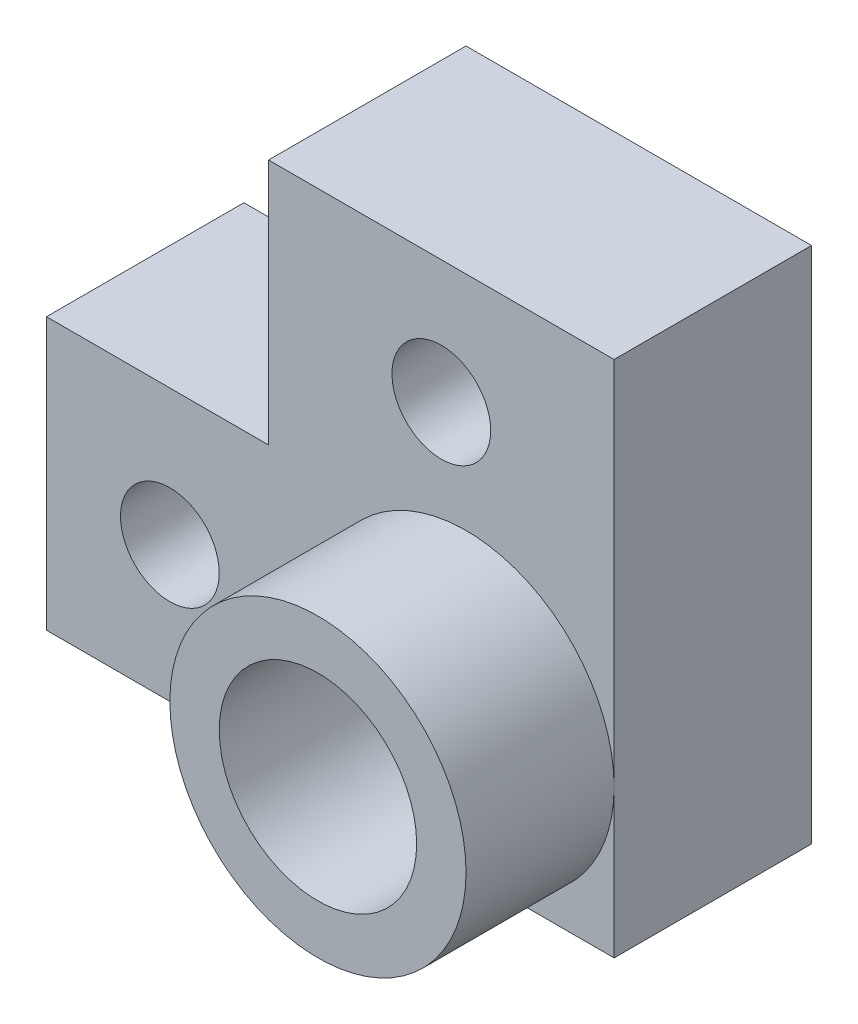
ISO-10303-21;
HEADER;
FILE_DESCRIPTION(('STEP AP214'),'2;1');
FILE_NAME('part.step','',(''),(''),'','','');
FILE_SCHEMA(('AUTOMOTIVE_DESIGN { 1 0 10303 214 1 1 1 1 }'));
ENDSEC;
DATA;
#1=APPLICATION_CONTEXT('core data for automotive mechanical design processes');
#2=APPLICATION_PROTOCOL_DEFINITION('international standard','automotive_design',2000,#1);
#3=PRODUCT_CONTEXT('',#1,'mechanical');
#4=PRODUCT('Part','Part','',(#3));
#5=PRODUCT_RELATED_PRODUCT_CATEGORY('part','',(#4));
#6=PRODUCT_DEFINITION_FORMATION('','',#4);
#7=PRODUCT_DEFINITION_CONTEXT('part definition',#1,'design');
#8=PRODUCT_DEFINITION('design','',#6,#7);
#9=PRODUCT_DEFINITION_SHAPE('','',#8);
#10=(LENGTH_UNIT() NAMED_UNIT(*) SI_UNIT(.MILLI.,.METRE.));
#11=(NAMED_UNIT(*) PLANE_ANGLE_UNIT() SI_UNIT($,.RADIAN.));
#12=(NAMED_UNIT(*) SI_UNIT($,.STERADIAN.) SOLID_ANGLE_UNIT());
#13=UNCERTAINTY_MEASURE_WITH_UNIT(LENGTH_MEASURE(1.E-05),#10,'distance_accuracy_value','');
#14=(GEOMETRIC_REPRESENTATION_CONTEXT(3) GLOBAL_UNCERTAINTY_ASSIGNED_CONTEXT((#13)) GLOBAL_UNIT_ASSIGNED_CONTEXT((#10,
#11,#12)) REPRESENTATION_CONTEXT('',''));
#15=CARTESIAN_POINT('',(0.,0.,0.));
#16=DIRECTION('',(0.,0.,1.));
#17=DIRECTION('',(1.,0.,0.));
#18=AXIS2_PLACEMENT_3D('',#15,#16,#17);
#19=CARTESIAN_POINT('',(0.,0.,8.));
#20=DIRECTION('',(0.,0.,1.));
#21=DIRECTION('',(1.,0.,0.));
#22=AXIS2_PLACEMENT_3D('',#19,#20,#21);
#23=PLANE('',#22);
#24=CARTESIAN_POINT('',(4.20529801324502,6.91390728476822,8.));
#25=DIRECTION('',(0.,0.,1.));
#26=DIRECTION('',(1.,0.,0.));
#27=AXIS2_PLACEMENT_3D('',#24,#25,#26);
#28=CIRCLE('',#27,6.);
#29=CARTESIAN_POINT('',(10.205298013245,6.91390728476822,8.));
#30=VERTEX_POINT('',#29);
#31=CARTESIAN_POINT('',(4.20529801324502,0.913907284768216,8.));
#32=VERTEX_POINT('',#31);
#33=EDGE_CURVE('E46',#30,#32,#28,.T.);
#34=ORIENTED_EDGE('',*,*,#33,.F.);
#35=DIRECTION('',(0.,1.,0.));
#36=VECTOR('',#35,1.);
#37=CARTESIAN_POINT('',(10.205298013245,11.9139072847682,8.));
#38=LINE('',#37,#36);
#39=CARTESIAN_POINT('',(10.205298013245,21.9139072847682,8.));
#40=VERTEX_POINT('',#39);
#41=EDGE_CURVE('E101',#30,#40,#38,.T.);
#42=ORIENTED_EDGE('',*,*,#41,.T.);
#43=DIRECTION('',(1.,0.,0.));
#44=VECTOR('',#43,1.);
#45=CARTESIAN_POINT('',(10.205298013245,21.9139072847682,8.));
#46=LINE('',#45,#44);
#47=CARTESIAN_POINT('',(-3.79470198675498,21.9139072847682,8.));
#48=VERTEX_POINT('',#47);
#49=EDGE_CURVE('E199',#48,#40,#46,.T.);
#50=ORIENTED_EDGE('',*,*,#49,.F.);
#51=DIRECTION('',(0.,-1.,0.));
#52=VECTOR('',#51,1.);
#53=CARTESIAN_POINT('',(-3.79470198675498,21.9139072847682,8.));
#54=LINE('',#53,#52);
#55=CARTESIAN_POINT('',(-3.79470198675498,11.9139072847682,8.));
#56=VERTEX_POINT('',#55);
#57=EDGE_CURVE('E201',#48,#56,#54,.T.);
#58=ORIENTED_EDGE('',*,*,#57,.T.);
#59=DIRECTION('',(-1.,0.,0.));
#60=VECTOR('',#59,1.);
#61=CARTESIAN_POINT('',(-12.794701986755,11.9139072847682,8.));
#62=LINE('',#61,#60);
#63=CARTESIAN_POINT('',(-12.794701986755,11.9139072847682,8.));
#64=VERTEX_POINT('',#63);
#65=EDGE_CURVE('E100',#56,#64,#62,.T.);
#66=ORIENTED_EDGE('',*,*,#65,.T.);
#67=DIRECTION('',(0.,-1.,0.));
#68=VECTOR('',#67,1.);
#69=CARTESIAN_POINT('',(-12.794701986755,11.9139072847682,8.));
#70=LINE('',#69,#68);
#71=CARTESIAN_POINT('',(-12.794701986755,0.913907284768216,8.));
#72=VERTEX_POINT('',#71);
#73=EDGE_CURVE('E177',#64,#72,#70,.T.);
#74=ORIENTED_EDGE('',*,*,#73,.T.);
#75=DIRECTION('',(1.,0.,0.));
#76=VECTOR('',#75,1.);
#77=CARTESIAN_POINT('',(-12.794701986755,0.913907284768216,8.));
#78=LINE('',#77,#76);
#79=EDGE_CURVE('E111',#72,#32,#78,.T.);
#80=ORIENTED_EDGE('',*,*,#79,.T.);
#81=EDGE_LOOP('',(#34,#42,#50,#58,#66,#74,#80));
#82=FACE_BOUND('',#81,.T.);
#83=CARTESIAN_POINT('',(-7.79470198675497,6.41390728476822,8.));
#84=DIRECTION('',(0.,0.,1.));
#85=DIRECTION('',(1.,0.,0.));
#86=AXIS2_PLACEMENT_3D('',#83,#84,#85);
#87=CIRCLE('',#86,2.);
#88=CARTESIAN_POINT('',(-5.79470198675497,6.41390728476822,8.));
#89=VERTEX_POINT('',#88);
#90=EDGE_CURVE('E187',#89,#89,#87,.T.);
#91=ORIENTED_EDGE('',*,*,#90,.F.);
#92=EDGE_LOOP('',(#91));
#93=FACE_BOUND('',#92,.T.);
#94=CARTESIAN_POINT('',(3.20529801324502,16.9139072847682,8.));
#95=DIRECTION('',(0.,0.,1.));
#96=DIRECTION('',(1.,0.,0.));
#97=AXIS2_PLACEMENT_3D('',#94,#95,#96);
#98=CIRCLE('',#97,2.);
#99=CARTESIAN_POINT('',(5.20529801324503,16.9139072847682,8.));
#100=VERTEX_POINT('',#99);
#101=EDGE_CURVE('E214',#100,#100,#98,.T.);
#102=ORIENTED_EDGE('',*,*,#101,.F.);
#103=EDGE_LOOP('',(#102));
#104=FACE_BOUND('',#103,.T.);
#105=ADVANCED_FACE('F35',(#82,#93,#104),#23,.T.);
#106=CARTESIAN_POINT('',(-12.794701986755,11.9139072847682,8.));
#107=DIRECTION('',(0.,-1.,0.));
#108=DIRECTION('',(0.,0.,-1.));
#109=AXIS2_PLACEMENT_3D('',#106,#107,#108);
#110=PLANE('',#109);
#111=DIRECTION('',(0.,0.,1.));
#112=VECTOR('',#111,1.);
#113=CARTESIAN_POINT('',(-3.79470198675498,11.9139072847682,8.));
#114=LINE('',#113,#112);
#115=CARTESIAN_POINT('',(-3.79470198675498,11.9139072847682,0.));
#116=VERTEX_POINT('',#115);
#117=EDGE_CURVE('E59',#116,#56,#114,.T.);
#118=ORIENTED_EDGE('',*,*,#117,.F.);
#119=DIRECTION('',(-1.,0.,0.));
#120=VECTOR('',#119,1.);
#121=CARTESIAN_POINT('',(-12.794701986755,11.9139072847682,0.));
#122=LINE('',#121,#120);
#123=CARTESIAN_POINT('',(-12.794701986755,11.9139072847682,0.));
#124=VERTEX_POINT('',#123);
#125=EDGE_CURVE('E175',#116,#124,#122,.T.);
#126=ORIENTED_EDGE('',*,*,#125,.T.);
#127=DIRECTION('',(0.,0.,-1.));
#128=VECTOR('',#127,1.);
#129=CARTESIAN_POINT('',(-12.794701986755,11.9139072847682,8.));
#130=LINE('',#129,#128);
#131=EDGE_CURVE('E171',#64,#124,#130,.T.);
#132=ORIENTED_EDGE('',*,*,#131,.F.);
#133=ORIENTED_EDGE('',*,*,#65,.F.);
#134=EDGE_LOOP('',(#118,#126,#132,#133));
#135=FACE_BOUND('',#134,.T.);
#136=ADVANCED_FACE('F133',(#135),#110,.F.);
#137=CARTESIAN_POINT('',(-12.794701986755,11.9139072847682,8.));
#138=DIRECTION('',(1.,0.,0.));
#139=DIRECTION('',(0.,0.,-1.));
#140=AXIS2_PLACEMENT_3D('',#137,#138,#139);
#141=PLANE('',#140);
#142=DIRECTION('',(0.,-1.,0.));
#143=VECTOR('',#142,1.);
#144=CARTESIAN_POINT('',(-12.794701986755,11.9139072847682,0.));
#145=LINE('',#144,#143);
#146=CARTESIAN_POINT('',(-12.794701986755,0.913907284768216,0.));
#147=VERTEX_POINT('',#146);
#148=EDGE_CURVE('E168',#124,#147,#145,.T.);
#149=ORIENTED_EDGE('',*,*,#148,.T.);
#150=DIRECTION('',(0.,0.,-1.));
#151=VECTOR('',#150,1.);
#152=CARTESIAN_POINT('',(-12.794701986755,0.913907284768216,8.));
#153=LINE('',#152,#151);
#154=EDGE_CURVE('E44',#72,#147,#153,.T.);
#155=ORIENTED_EDGE('',*,*,#154,.F.);
#156=ORIENTED_EDGE('',*,*,#73,.F.);
#157=ORIENTED_EDGE('',*,*,#131,.T.);
#158=EDGE_LOOP('',(#149,#155,#156,#157));
#159=FACE_BOUND('',#158,.T.);
#160=ADVANCED_FACE('F37',(#159),#141,.F.);
#161=CARTESIAN_POINT('',(-12.794701986755,0.913907284768216,8.));
#162=DIRECTION('',(0.,1.,0.));
#163=DIRECTION('',(0.,0.,1.));
#164=AXIS2_PLACEMENT_3D('',#161,#162,#163);
#165=PLANE('',#164);
#166=DIRECTION('',(1.,0.,0.));
#167=VECTOR('',#166,1.);
#168=CARTESIAN_POINT('',(-12.794701986755,0.913907284768216,0.));
#169=LINE('',#168,#167);
#170=CARTESIAN_POINT('',(10.205298013245,0.913907284768216,0.));
#171=VERTEX_POINT('',#170);
#172=EDGE_CURVE('E160',#147,#171,#169,.T.);
#173=ORIENTED_EDGE('',*,*,#172,.T.);
#174=DIRECTION('',(0.,0.,-1.));
#175=VECTOR('',#174,1.);
#176=CARTESIAN_POINT('',(10.205298013245,0.913907284768216,8.));
#177=LINE('',#176,#175);
#178=CARTESIAN_POINT('',(10.205298013245,0.913907284768216,8.));
#179=VERTEX_POINT('',#178);
#180=EDGE_CURVE('E161',#179,#171,#177,.T.);
#181=ORIENTED_EDGE('',*,*,#180,.F.);
#182=EDGE_CURVE('E96',#32,#179,#78,.T.);
#183=ORIENTED_EDGE('',*,*,#182,.F.);
#184=ORIENTED_EDGE('',*,*,#79,.F.);
#185=ORIENTED_EDGE('',*,*,#154,.T.);
#186=EDGE_LOOP('',(#173,#181,#183,#184,#185));
#187=FACE_BOUND('',#186,.T.);
#188=ADVANCED_FACE('F149',(#187),#165,.F.);
#189=CARTESIAN_POINT('',(10.205298013245,11.9139072847682,8.));
#190=DIRECTION('',(-1.,0.,0.));
#191=DIRECTION('',(0.,0.,1.));
#192=AXIS2_PLACEMENT_3D('',#189,#190,#191);
#193=PLANE('',#192);
#194=DIRECTION('',(0.,1.,0.));
#195=VECTOR('',#194,1.);
#196=CARTESIAN_POINT('',(10.205298013245,11.9139072847682,0.));
#197=LINE('',#196,#195);
#198=CARTESIAN_POINT('',(10.205298013245,21.9139072847682,0.));
#199=VERTEX_POINT('',#198);
#200=EDGE_CURVE('E167',#171,#199,#197,.T.);
#201=ORIENTED_EDGE('',*,*,#200,.T.);
#202=DIRECTION('',(0.,0.,-1.));
#203=VECTOR('',#202,1.);
#204=CARTESIAN_POINT('',(10.205298013245,21.9139072847682,8.));
#205=LINE('',#204,#203);
#206=EDGE_CURVE('E107',#40,#199,#205,.T.);
#207=ORIENTED_EDGE('',*,*,#206,.F.);
#208=ORIENTED_EDGE('',*,*,#41,.F.);
#209=EDGE_CURVE('E93',#179,#30,#38,.T.);
#210=ORIENTED_EDGE('',*,*,#209,.F.);
#211=ORIENTED_EDGE('',*,*,#180,.T.);
#212=EDGE_LOOP('',(#201,#207,#208,#210,#211));
#213=FACE_BOUND('',#212,.T.);
#214=ADVANCED_FACE('F105',(#213),#193,.F.);
#215=EDGE_CURVE('E11',#32,#30,#28,.T.);
#216=ORIENTED_EDGE('',*,*,#215,.F.);
#217=ORIENTED_EDGE('',*,*,#182,.T.);
#218=ORIENTED_EDGE('',*,*,#209,.T.);
#219=EDGE_LOOP('',(#216,#217,#218));
#220=FACE_BOUND('',#219,.T.);
#221=ADVANCED_FACE('F95',(#220),#23,.T.);
#222=CARTESIAN_POINT('',(0.,0.,0.));
#223=DIRECTION('',(0.,0.,1.));
#224=DIRECTION('',(1.,0.,0.));
#225=AXIS2_PLACEMENT_3D('',#222,#223,#224);
#226=PLANE('',#225);
#227=CARTESIAN_POINT('',(4.20529801324502,6.91390728476822,0.));
#228=DIRECTION('',(0.,0.,1.));
#229=DIRECTION('',(1.,0.,0.));
#230=AXIS2_PLACEMENT_3D('',#227,#228,#229);
#231=CIRCLE('',#230,4.);
#232=CARTESIAN_POINT('',(8.20529801324503,6.91390728476822,0.));
#233=VERTEX_POINT('',#232);
#234=EDGE_CURVE('E39',#233,#233,#231,.T.);
#235=ORIENTED_EDGE('',*,*,#234,.T.);
#236=EDGE_LOOP('',(#235));
#237=FACE_BOUND('',#236,.T.);
#238=CARTESIAN_POINT('',(-7.79470198675497,6.41390728476822,0.));
#239=DIRECTION('',(0.,0.,1.));
#240=DIRECTION('',(1.,0.,0.));
#241=AXIS2_PLACEMENT_3D('',#238,#239,#240);
#242=CIRCLE('',#241,2.);
#243=CARTESIAN_POINT('',(-5.79470198675497,6.41390728476822,0.));
#244=VERTEX_POINT('',#243);
#245=EDGE_CURVE('E186',#244,#244,#242,.T.);
#246=ORIENTED_EDGE('',*,*,#245,.T.);
#247=EDGE_LOOP('',(#246));
#248=FACE_BOUND('',#247,.T.);
#249=CARTESIAN_POINT('',(3.20529801324502,16.9139072847682,0.));
#250=DIRECTION('',(0.,0.,1.));
#251=DIRECTION('',(1.,0.,0.));
#252=AXIS2_PLACEMENT_3D('',#249,#250,#251);
#253=CIRCLE('',#252,2.);
#254=CARTESIAN_POINT('',(5.20529801324503,16.9139072847682,0.));
#255=VERTEX_POINT('',#254);
#256=EDGE_CURVE('E184',#255,#255,#253,.T.);
#257=ORIENTED_EDGE('',*,*,#256,.T.);
#258=EDGE_LOOP('',(#257));
#259=FACE_BOUND('',#258,.T.);
#260=ORIENTED_EDGE('',*,*,#148,.F.);
#261=ORIENTED_EDGE('',*,*,#125,.F.);
#262=DIRECTION('',(0.,-1.,0.));
#263=VECTOR('',#262,1.);
#264=CARTESIAN_POINT('',(-3.79470198675498,21.9139072847682,0.));
#265=LINE('',#264,#263);
#266=CARTESIAN_POINT('',(-3.79470198675498,21.9139072847682,0.));
#267=VERTEX_POINT('',#266);
#268=EDGE_CURVE('E203',#267,#116,#265,.T.);
#269=ORIENTED_EDGE('',*,*,#268,.F.);
#270=DIRECTION('',(-1.,0.,0.));
#271=VECTOR('',#270,1.);
#272=CARTESIAN_POINT('',(10.205298013245,21.9139072847682,0.));
#273=LINE('',#272,#271);
#274=EDGE_CURVE('E174',#199,#267,#273,.T.);
#275=ORIENTED_EDGE('',*,*,#274,.F.);
#276=ORIENTED_EDGE('',*,*,#200,.F.);
#277=ORIENTED_EDGE('',*,*,#172,.F.);
#278=EDGE_LOOP('',(#260,#261,#269,#275,#276,#277));
#279=FACE_BOUND('',#278,.T.);
#280=ADVANCED_FACE('F142',(#237,#248,#259,#279),#226,.F.);
#281=CARTESIAN_POINT('',(-3.79470198675498,21.9139072847682,8.));
#282=DIRECTION('',(1.,0.,0.));
#283=DIRECTION('',(0.,0.,-1.));
#284=AXIS2_PLACEMENT_3D('',#281,#282,#283);
#285=PLANE('',#284);
#286=ORIENTED_EDGE('',*,*,#117,.T.);
#287=ORIENTED_EDGE('',*,*,#57,.F.);
#288=DIRECTION('',(0.,0.,1.));
#289=VECTOR('',#288,1.);
#290=CARTESIAN_POINT('',(-3.79470198675498,21.9139072847682,8.));
#291=LINE('',#290,#289);
#292=EDGE_CURVE('E210',#267,#48,#291,.T.);
#293=ORIENTED_EDGE('',*,*,#292,.F.);
#294=ORIENTED_EDGE('',*,*,#268,.T.);
#295=EDGE_LOOP('',(#286,#287,#293,#294));
#296=FACE_BOUND('',#295,.T.);
#297=ADVANCED_FACE('F147',(#296),#285,.F.);
#298=CARTESIAN_POINT('',(0.,21.9139072847682,0.));
#299=DIRECTION('',(0.,1.,0.));
#300=DIRECTION('',(0.,0.,1.));
#301=AXIS2_PLACEMENT_3D('',#298,#299,#300);
#302=PLANE('',#301);
#303=ORIENTED_EDGE('',*,*,#206,.T.);
#304=ORIENTED_EDGE('',*,*,#274,.T.);
#305=ORIENTED_EDGE('',*,*,#292,.T.);
#306=ORIENTED_EDGE('',*,*,#49,.T.);
#307=EDGE_LOOP('',(#303,#304,#305,#306));
#308=FACE_BOUND('',#307,.T.);
#309=ADVANCED_FACE('F238',(#308),#302,.T.);
#310=CARTESIAN_POINT('',(3.20529801324502,16.9139072847682,-12.));
#311=DIRECTION('',(0.,0.,1.));
#312=DIRECTION('',(1.,0.,0.));
#313=AXIS2_PLACEMENT_3D('',#310,#311,#312);
#314=CYLINDRICAL_SURFACE('',#313,2.);
#315=ORIENTED_EDGE('',*,*,#101,.T.);
#316=EDGE_LOOP('',(#315));
#317=FACE_BOUND('',#316,.T.);
#318=ORIENTED_EDGE('',*,*,#256,.F.);
#319=EDGE_LOOP('',(#318));
#320=FACE_BOUND('',#319,.T.);
#321=ADVANCED_FACE('F231',(#317,#320),#314,.F.);
#322=CARTESIAN_POINT('',(-7.79470198675497,6.41390728476822,-12.));
#323=DIRECTION('',(0.,0.,1.));
#324=DIRECTION('',(1.,0.,0.));
#325=AXIS2_PLACEMENT_3D('',#322,#323,#324);
#326=CYLINDRICAL_SURFACE('',#325,2.);
#327=ORIENTED_EDGE('',*,*,#90,.T.);
#328=EDGE_LOOP('',(#327));
#329=FACE_BOUND('',#328,.T.);
#330=ORIENTED_EDGE('',*,*,#245,.F.);
#331=EDGE_LOOP('',(#330));
#332=FACE_BOUND('',#331,.T.);
#333=ADVANCED_FACE('F226',(#329,#332),#326,.F.);
#334=CARTESIAN_POINT('',(4.20529801324502,6.91390728476822,-12.));
#335=DIRECTION('',(0.,0.,1.));
#336=DIRECTION('',(1.,0.,0.));
#337=AXIS2_PLACEMENT_3D('',#334,#335,#336);
#338=CYLINDRICAL_SURFACE('',#337,4.);
#339=ORIENTED_EDGE('',*,*,#234,.F.);
#340=EDGE_LOOP('',(#339));
#341=FACE_BOUND('',#340,.T.);
#342=CARTESIAN_POINT('',(4.20529801324502,6.91390728476822,14.));
#343=DIRECTION('',(0.,0.,1.));
#344=DIRECTION('',(1.,0.,0.));
#345=AXIS2_PLACEMENT_3D('',#342,#343,#344);
#346=CIRCLE('',#345,4.);
#347=CARTESIAN_POINT('',(8.20529801324503,6.91390728476822,14.));
#348=VERTEX_POINT('',#347);
#349=EDGE_CURVE('E118',#348,#348,#346,.T.);
#350=ORIENTED_EDGE('',*,*,#349,.T.);
#351=EDGE_LOOP('',(#350));
#352=FACE_BOUND('',#351,.T.);
#353=ADVANCED_FACE('F127',(#341,#352),#338,.F.);
#354=CARTESIAN_POINT('',(4.20529801324502,6.91390728476822,14.));
#355=DIRECTION('',(0.,0.,1.));
#356=DIRECTION('',(1.,0.,0.));
#357=AXIS2_PLACEMENT_3D('',#354,#355,#356);
#358=PLANE('',#357);
#359=CARTESIAN_POINT('',(4.20529801324502,6.91390728476822,14.));
#360=DIRECTION('',(0.,0.,1.));
#361=DIRECTION('',(1.,0.,0.));
#362=AXIS2_PLACEMENT_3D('',#359,#360,#361);
#363=CIRCLE('',#362,6.);
#364=CARTESIAN_POINT('',(10.205298013245,6.91390728476822,14.));
#365=VERTEX_POINT('',#364);
#366=EDGE_CURVE('E117',#365,#365,#363,.T.);
#367=ORIENTED_EDGE('',*,*,#366,.T.);
#368=EDGE_LOOP('',(#367));
#369=FACE_BOUND('',#368,.T.);
#370=ORIENTED_EDGE('',*,*,#349,.F.);
#371=EDGE_LOOP('',(#370));
#372=FACE_BOUND('',#371,.T.);
#373=ADVANCED_FACE('F121',(#369,#372),#358,.T.);
#374=CARTESIAN_POINT('',(4.20529801324502,6.91390728476822,14.));
#375=DIRECTION('',(0.,0.,-1.));
#376=DIRECTION('',(-1.,0.,0.));
#377=AXIS2_PLACEMENT_3D('',#374,#375,#376);
#378=CYLINDRICAL_SURFACE('',#377,6.);
#379=ORIENTED_EDGE('',*,*,#366,.F.);
#380=EDGE_LOOP('',(#379));
#381=FACE_BOUND('',#380,.T.);
#382=ORIENTED_EDGE('',*,*,#33,.T.);
#383=ORIENTED_EDGE('',*,*,#215,.T.);
#384=EDGE_LOOP('',(#382,#383));
#385=FACE_BOUND('',#384,.T.);
#386=ADVANCED_FACE('F119',(#381,#385),#378,.T.);
#387=CLOSED_SHELL('',(#105,#136,#160,#188,#214,#221,#280,#297,#309,#321,#333,#353,#373,#386));
#388=MANIFOLD_SOLID_BREP('B2',#387);
#389=ADVANCED_BREP_SHAPE_REPRESENTATION('',(#18,#388),#14);
#390=SHAPE_DEFINITION_REPRESENTATION(#9,#389);
ENDSEC;
END-ISO-10303-21;
